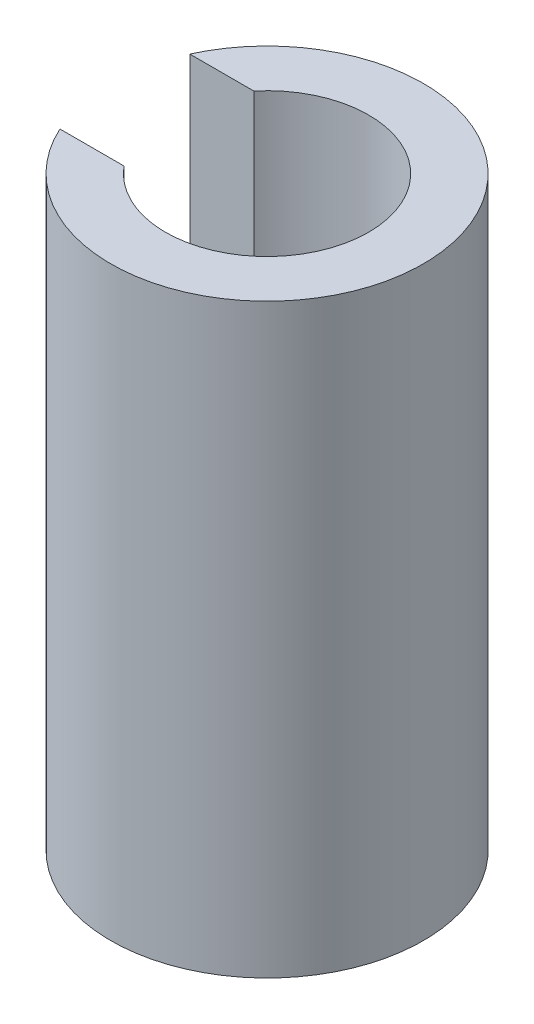
ISO-10303-21;
HEADER;
FILE_DESCRIPTION(('STEP AP214'),'2;1');
FILE_NAME('part.step','',(''),(''),'','','');
FILE_SCHEMA(('AUTOMOTIVE_DESIGN { 1 0 10303 214 1 1 1 1 }'));
ENDSEC;
DATA;
#1=APPLICATION_CONTEXT('core data for automotive mechanical design processes');
#2=APPLICATION_PROTOCOL_DEFINITION('international standard','automotive_design',2000,#1);
#3=PRODUCT_CONTEXT('',#1,'mechanical');
#4=PRODUCT('Part','Part','',(#3));
#5=PRODUCT_RELATED_PRODUCT_CATEGORY('part','',(#4));
#6=PRODUCT_DEFINITION_FORMATION('','',#4);
#7=PRODUCT_DEFINITION_CONTEXT('part definition',#1,'design');
#8=PRODUCT_DEFINITION('design','',#6,#7);
#9=PRODUCT_DEFINITION_SHAPE('','',#8);
#10=(LENGTH_UNIT() NAMED_UNIT(*) SI_UNIT(.MILLI.,.METRE.));
#11=(NAMED_UNIT(*) PLANE_ANGLE_UNIT() SI_UNIT($,.RADIAN.));
#12=(NAMED_UNIT(*) SI_UNIT($,.STERADIAN.) SOLID_ANGLE_UNIT());
#13=UNCERTAINTY_MEASURE_WITH_UNIT(LENGTH_MEASURE(1.E-05),#10,'distance_accuracy_value','');
#14=(GEOMETRIC_REPRESENTATION_CONTEXT(3) GLOBAL_UNCERTAINTY_ASSIGNED_CONTEXT((#13)) GLOBAL_UNIT_ASSIGNED_CONTEXT((#10,
#11,#12)) REPRESENTATION_CONTEXT('',''));
#15=CARTESIAN_POINT('',(0.,0.,0.));
#16=DIRECTION('',(0.,0.,1.));
#17=DIRECTION('',(1.,0.,0.));
#18=AXIS2_PLACEMENT_3D('',#15,#16,#17);
#19=CARTESIAN_POINT('',(0.,15.,0.));
#20=DIRECTION('',(0.,1.,0.));
#21=DIRECTION('',(0.,0.,1.));
#22=AXIS2_PLACEMENT_3D('',#19,#20,#21);
#23=PLANE('',#22);
#24=DIRECTION('',(-1.,0.,0.));
#25=VECTOR('',#24,1.);
#26=CARTESIAN_POINT('',(-4.,15.,-1.66132477258361));
#27=LINE('',#26,#25);
#28=CARTESIAN_POINT('',(-2.,15.,-1.66132477258361));
#29=VERTEX_POINT('',#28);
#30=CARTESIAN_POINT('',(-3.63868107973205,15.,-1.66132477258361));
#31=VERTEX_POINT('',#30);
#32=EDGE_CURVE('E97',#29,#31,#27,.T.);
#33=ORIENTED_EDGE('',*,*,#32,.F.);
#34=CARTESIAN_POINT('',(0.,15.,0.));
#35=DIRECTION('',(0.,1.,0.));
#36=DIRECTION('',(0.,0.,1.));
#37=AXIS2_PLACEMENT_3D('',#34,#35,#36);
#38=CIRCLE('',#37,2.6);
#39=CARTESIAN_POINT('',(-2.,15.,1.66132477258361));
#40=VERTEX_POINT('',#39);
#41=EDGE_CURVE('E101',#40,#29,#38,.T.);
#42=ORIENTED_EDGE('',*,*,#41,.F.);
#43=DIRECTION('',(1.,0.,0.));
#44=VECTOR('',#43,1.);
#45=CARTESIAN_POINT('',(-4.,15.,1.66132477258361));
#46=LINE('',#45,#44);
#47=CARTESIAN_POINT('',(-3.63868107973205,15.,1.66132477258361));
#48=VERTEX_POINT('',#47);
#49=EDGE_CURVE('E63',#48,#40,#46,.T.);
#50=ORIENTED_EDGE('',*,*,#49,.F.);
#51=CARTESIAN_POINT('',(0.,15.,0.));
#52=DIRECTION('',(0.,1.,0.));
#53=DIRECTION('',(0.,0.,1.));
#54=AXIS2_PLACEMENT_3D('',#51,#52,#53);
#55=CIRCLE('',#54,4.);
#56=EDGE_CURVE('E11',#48,#31,#55,.T.);
#57=ORIENTED_EDGE('',*,*,#56,.T.);
#58=EDGE_LOOP('',(#33,#42,#50,#57));
#59=FACE_BOUND('',#58,.T.);
#60=ADVANCED_FACE('F39',(#59),#23,.T.);
#61=CARTESIAN_POINT('',(0.,0.,0.));
#62=DIRECTION('',(0.,1.,0.));
#63=DIRECTION('',(0.,0.,1.));
#64=AXIS2_PLACEMENT_3D('',#61,#62,#63);
#65=PLANE('',#64);
#66=CARTESIAN_POINT('',(0.,0.,0.));
#67=DIRECTION('',(0.,1.,0.));
#68=DIRECTION('',(0.,0.,1.));
#69=AXIS2_PLACEMENT_3D('',#66,#67,#68);
#70=CIRCLE('',#69,2.6);
#71=CARTESIAN_POINT('',(-2.,0.,1.66132477258361));
#72=VERTEX_POINT('',#71);
#73=CARTESIAN_POINT('',(-2.,0.,-1.66132477258361));
#74=VERTEX_POINT('',#73);
#75=EDGE_CURVE('E94',#72,#74,#70,.T.);
#76=ORIENTED_EDGE('',*,*,#75,.T.);
#77=DIRECTION('',(-1.,0.,0.));
#78=VECTOR('',#77,1.);
#79=CARTESIAN_POINT('',(-4.,0.,-1.66132477258361));
#80=LINE('',#79,#78);
#81=CARTESIAN_POINT('',(-3.63868107973205,0.,-1.66132477258361));
#82=VERTEX_POINT('',#81);
#83=EDGE_CURVE('E55',#74,#82,#80,.T.);
#84=ORIENTED_EDGE('',*,*,#83,.T.);
#85=CARTESIAN_POINT('',(0.,0.,0.));
#86=DIRECTION('',(0.,1.,0.));
#87=DIRECTION('',(0.,0.,1.));
#88=AXIS2_PLACEMENT_3D('',#85,#86,#87);
#89=CIRCLE('',#88,4.);
#90=CARTESIAN_POINT('',(-3.63868107973205,0.,1.66132477258361));
#91=VERTEX_POINT('',#90);
#92=EDGE_CURVE('E43',#91,#82,#89,.T.);
#93=ORIENTED_EDGE('',*,*,#92,.F.);
#94=DIRECTION('',(1.,0.,0.));
#95=VECTOR('',#94,1.);
#96=CARTESIAN_POINT('',(-4.,0.,1.66132477258361));
#97=LINE('',#96,#95);
#98=EDGE_CURVE('E81',#91,#72,#97,.T.);
#99=ORIENTED_EDGE('',*,*,#98,.T.);
#100=EDGE_LOOP('',(#76,#84,#93,#99));
#101=FACE_BOUND('',#100,.T.);
#102=ADVANCED_FACE('F93',(#101),#65,.F.);
#103=CARTESIAN_POINT('',(0.,15.,0.));
#104=DIRECTION('',(0.,-1.,0.));
#105=DIRECTION('',(0.,0.,-1.));
#106=AXIS2_PLACEMENT_3D('',#103,#104,#105);
#107=CYLINDRICAL_SURFACE('',#106,4.);
#108=ORIENTED_EDGE('',*,*,#92,.T.);
#109=DIRECTION('',(0.,-1.,0.));
#110=VECTOR('',#109,1.);
#111=CARTESIAN_POINT('',(-3.63868107973205,15.,-1.66132477258361));
#112=LINE('',#111,#110);
#113=EDGE_CURVE('E102',#82,#31,#112,.F.);
#114=ORIENTED_EDGE('',*,*,#113,.T.);
#115=ORIENTED_EDGE('',*,*,#56,.F.);
#116=DIRECTION('',(0.,-1.,0.));
#117=VECTOR('',#116,1.);
#118=CARTESIAN_POINT('',(-3.63868107973205,15.,1.66132477258361));
#119=LINE('',#118,#117);
#120=EDGE_CURVE('E108',#48,#91,#119,.T.);
#121=ORIENTED_EDGE('',*,*,#120,.T.);
#122=EDGE_LOOP('',(#108,#114,#115,#121));
#123=FACE_BOUND('',#122,.T.);
#124=ADVANCED_FACE('F41',(#123),#107,.T.);
#125=CARTESIAN_POINT('',(0.,15.,0.));
#126=DIRECTION('',(0.,-1.,0.));
#127=DIRECTION('',(0.,0.,-1.));
#128=AXIS2_PLACEMENT_3D('',#125,#126,#127);
#129=CYLINDRICAL_SURFACE('',#128,2.6);
#130=DIRECTION('',(0.,1.,0.));
#131=VECTOR('',#130,1.);
#132=CARTESIAN_POINT('',(-2.,0.,-1.66132477258361));
#133=LINE('',#132,#131);
#134=EDGE_CURVE('E88',#74,#29,#133,.T.);
#135=ORIENTED_EDGE('',*,*,#134,.F.);
#136=ORIENTED_EDGE('',*,*,#75,.F.);
#137=DIRECTION('',(0.,1.,0.));
#138=VECTOR('',#137,1.);
#139=CARTESIAN_POINT('',(-2.,0.,1.66132477258361));
#140=LINE('',#139,#138);
#141=EDGE_CURVE('E78',#72,#40,#140,.T.);
#142=ORIENTED_EDGE('',*,*,#141,.T.);
#143=ORIENTED_EDGE('',*,*,#41,.T.);
#144=EDGE_LOOP('',(#135,#136,#142,#143));
#145=FACE_BOUND('',#144,.T.);
#146=ADVANCED_FACE('F99',(#145),#129,.F.);
#147=CARTESIAN_POINT('',(-4.,0.,1.66132477258361));
#148=DIRECTION('',(0.,0.,1.));
#149=DIRECTION('',(1.,0.,0.));
#150=AXIS2_PLACEMENT_3D('',#147,#148,#149);
#151=PLANE('',#150);
#152=ORIENTED_EDGE('',*,*,#49,.T.);
#153=ORIENTED_EDGE('',*,*,#141,.F.);
#154=ORIENTED_EDGE('',*,*,#98,.F.);
#155=ORIENTED_EDGE('',*,*,#120,.F.);
#156=EDGE_LOOP('',(#152,#153,#154,#155));
#157=FACE_BOUND('',#156,.T.);
#158=ADVANCED_FACE('F80',(#157),#151,.F.);
#159=CARTESIAN_POINT('',(-4.,0.,-1.66132477258361));
#160=DIRECTION('',(0.,0.,-1.));
#161=DIRECTION('',(-1.,0.,0.));
#162=AXIS2_PLACEMENT_3D('',#159,#160,#161);
#163=PLANE('',#162);
#164=ORIENTED_EDGE('',*,*,#83,.F.);
#165=ORIENTED_EDGE('',*,*,#134,.T.);
#166=ORIENTED_EDGE('',*,*,#32,.T.);
#167=ORIENTED_EDGE('',*,*,#113,.F.);
#168=EDGE_LOOP('',(#164,#165,#166,#167));
#169=FACE_BOUND('',#168,.T.);
#170=ADVANCED_FACE('F125',(#169),#163,.F.);
#171=CLOSED_SHELL('',(#60,#102,#124,#146,#158,#170));
#172=MANIFOLD_SOLID_BREP('B2',#171);
#173=ADVANCED_BREP_SHAPE_REPRESENTATION('',(#18,#172),#14);
#174=SHAPE_DEFINITION_REPRESENTATION(#9,#173);
ENDSEC;
END-ISO-10303-21;
